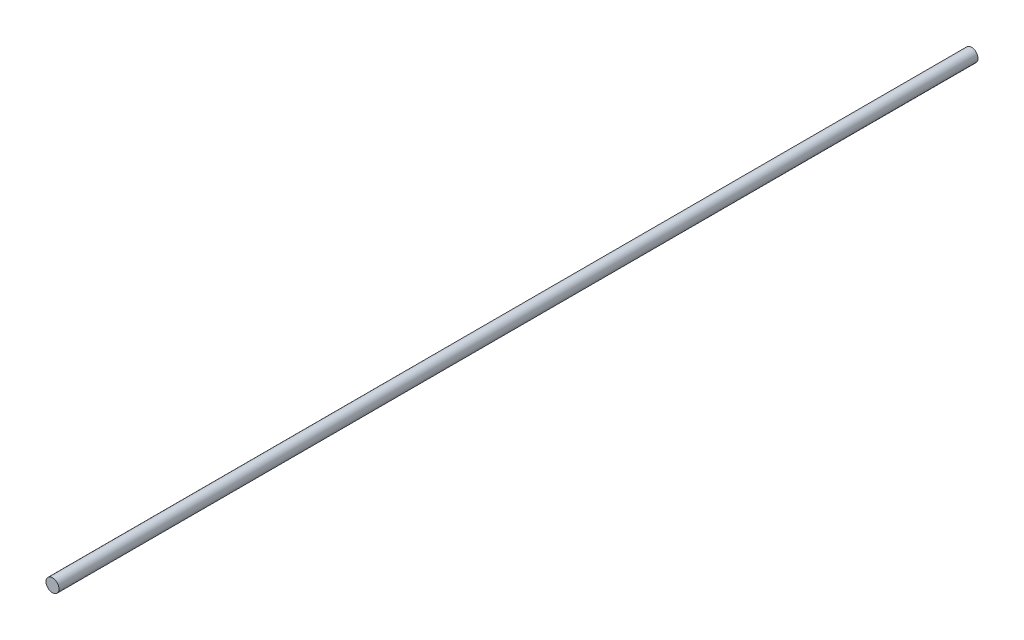
ISO-10303-21;
HEADER;
FILE_DESCRIPTION(('STEP AP214'),'2;1');
FILE_NAME('part.step','',(''),(''),'','','');
FILE_SCHEMA(('AUTOMOTIVE_DESIGN { 1 0 10303 214 1 1 1 1 }'));
ENDSEC;
DATA;
#1=APPLICATION_CONTEXT('core data for automotive mechanical design processes');
#2=APPLICATION_PROTOCOL_DEFINITION('international standard','automotive_design',2000,#1);
#3=PRODUCT_CONTEXT('',#1,'mechanical');
#4=PRODUCT('Part','Part','',(#3));
#5=PRODUCT_RELATED_PRODUCT_CATEGORY('part','',(#4));
#6=PRODUCT_DEFINITION_FORMATION('','',#4);
#7=PRODUCT_DEFINITION_CONTEXT('part definition',#1,'design');
#8=PRODUCT_DEFINITION('design','',#6,#7);
#9=PRODUCT_DEFINITION_SHAPE('','',#8);
#10=(LENGTH_UNIT() NAMED_UNIT(*) SI_UNIT(.MILLI.,.METRE.));
#11=(NAMED_UNIT(*) PLANE_ANGLE_UNIT() SI_UNIT($,.RADIAN.));
#12=(NAMED_UNIT(*) SI_UNIT($,.STERADIAN.) SOLID_ANGLE_UNIT());
#13=UNCERTAINTY_MEASURE_WITH_UNIT(LENGTH_MEASURE(1.E-05),#10,'distance_accuracy_value','');
#14=(GEOMETRIC_REPRESENTATION_CONTEXT(3) GLOBAL_UNCERTAINTY_ASSIGNED_CONTEXT((#13)) GLOBAL_UNIT_ASSIGNED_CONTEXT((#10,
#11,#12)) REPRESENTATION_CONTEXT('',''));
#15=CARTESIAN_POINT('',(0.,0.,0.));
#16=DIRECTION('',(0.,0.,1.));
#17=DIRECTION('',(1.,0.,0.));
#18=AXIS2_PLACEMENT_3D('',#15,#16,#17);
#19=CARTESIAN_POINT('',(0.,0.,1770.));
#20=DIRECTION('',(0.,0.,-1.));
#21=DIRECTION('',(-1.,0.,0.));
#22=AXIS2_PLACEMENT_3D('',#19,#20,#21);
#23=CYLINDRICAL_SURFACE('',#22,12.5);
#24=CARTESIAN_POINT('',(0.,0.,1770.));
#25=DIRECTION('',(0.,0.,1.));
#26=DIRECTION('',(1.,0.,0.));
#27=AXIS2_PLACEMENT_3D('',#24,#25,#26);
#28=CIRCLE('',#27,12.5);
#29=CARTESIAN_POINT('',(12.5,0.,1770.));
#30=VERTEX_POINT('',#29);
#31=EDGE_CURVE('E10',#30,#30,#28,.T.);
#32=ORIENTED_EDGE('',*,*,#31,.F.);
#33=EDGE_LOOP('',(#32));
#34=FACE_BOUND('',#33,.T.);
#35=CARTESIAN_POINT('',(0.,0.,0.));
#36=DIRECTION('',(0.,0.,1.));
#37=DIRECTION('',(1.,0.,0.));
#38=AXIS2_PLACEMENT_3D('',#35,#36,#37);
#39=CIRCLE('',#38,12.5);
#40=CARTESIAN_POINT('',(12.5,0.,0.));
#41=VERTEX_POINT('',#40);
#42=EDGE_CURVE('E34',#41,#41,#39,.T.);
#43=ORIENTED_EDGE('',*,*,#42,.T.);
#44=EDGE_LOOP('',(#43));
#45=FACE_BOUND('',#44,.T.);
#46=ADVANCED_FACE('F31',(#34,#45),#23,.T.);
#47=CARTESIAN_POINT('',(0.,0.,1770.));
#48=DIRECTION('',(0.,0.,1.));
#49=DIRECTION('',(1.,0.,0.));
#50=AXIS2_PLACEMENT_3D('',#47,#48,#49);
#51=PLANE('',#50);
#52=ORIENTED_EDGE('',*,*,#31,.T.);
#53=EDGE_LOOP('',(#52));
#54=FACE_BOUND('',#53,.T.);
#55=ADVANCED_FACE('F46',(#54),#51,.T.);
#56=CARTESIAN_POINT('',(0.,0.,0.));
#57=DIRECTION('',(0.,0.,1.));
#58=DIRECTION('',(1.,0.,0.));
#59=AXIS2_PLACEMENT_3D('',#56,#57,#58);
#60=PLANE('',#59);
#61=ORIENTED_EDGE('',*,*,#42,.F.);
#62=EDGE_LOOP('',(#61));
#63=FACE_BOUND('',#62,.T.);
#64=ADVANCED_FACE('F44',(#63),#60,.F.);
#65=CLOSED_SHELL('',(#46,#55,#64));
#66=MANIFOLD_SOLID_BREP('B2',#65);
#67=ADVANCED_BREP_SHAPE_REPRESENTATION('',(#18,#66),#14);
#68=SHAPE_DEFINITION_REPRESENTATION(#9,#67);
ENDSEC;
END-ISO-10303-21;
